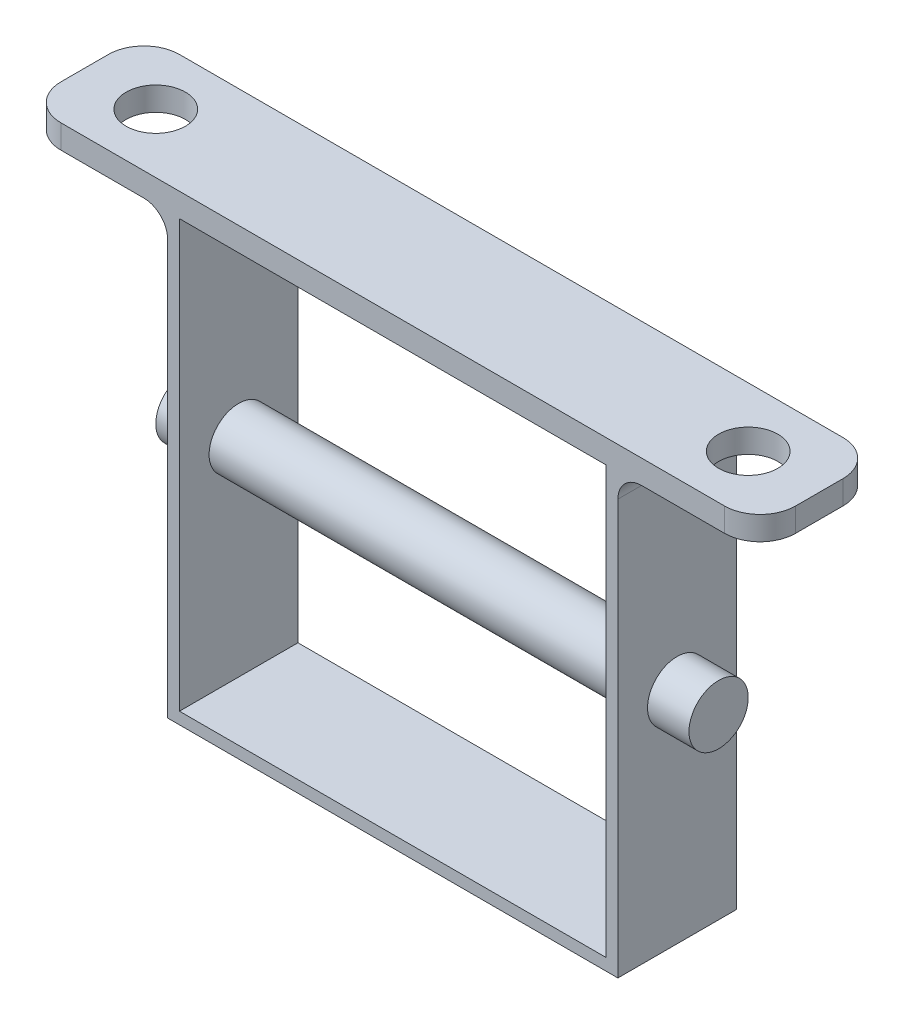
ISO-10303-21;
HEADER;
FILE_DESCRIPTION(('STEP AP214'),'2;1');
FILE_NAME('part.step','',(''),(''),'','','');
FILE_SCHEMA(('AUTOMOTIVE_DESIGN { 1 0 10303 214 1 1 1 1 }'));
ENDSEC;
DATA;
#1=APPLICATION_CONTEXT('core data for automotive mechanical design processes');
#2=APPLICATION_PROTOCOL_DEFINITION('international standard','automotive_design',2000,#1);
#3=PRODUCT_CONTEXT('',#1,'mechanical');
#4=PRODUCT('Part','Part','',(#3));
#5=PRODUCT_RELATED_PRODUCT_CATEGORY('part','',(#4));
#6=PRODUCT_DEFINITION_FORMATION('','',#4);
#7=PRODUCT_DEFINITION_CONTEXT('part definition',#1,'design');
#8=PRODUCT_DEFINITION('design','',#6,#7);
#9=PRODUCT_DEFINITION_SHAPE('','',#8);
#10=(LENGTH_UNIT() NAMED_UNIT(*) SI_UNIT(.MILLI.,.METRE.));
#11=(NAMED_UNIT(*) PLANE_ANGLE_UNIT() SI_UNIT($,.RADIAN.));
#12=(NAMED_UNIT(*) SI_UNIT($,.STERADIAN.) SOLID_ANGLE_UNIT());
#13=UNCERTAINTY_MEASURE_WITH_UNIT(LENGTH_MEASURE(1.E-05),#10,'distance_accuracy_value','');
#14=(GEOMETRIC_REPRESENTATION_CONTEXT(3) GLOBAL_UNCERTAINTY_ASSIGNED_CONTEXT((#13)) GLOBAL_UNIT_ASSIGNED_CONTEXT((#10,
#11,#12)) REPRESENTATION_CONTEXT('',''));
#15=CARTESIAN_POINT('',(0.,0.,0.));
#16=DIRECTION('',(0.,0.,1.));
#17=DIRECTION('',(1.,0.,0.));
#18=AXIS2_PLACEMENT_3D('',#15,#16,#17);
#19=CARTESIAN_POINT('',(0.,0.,25.4));
#20=DIRECTION('',(1.,0.,0.));
#21=DIRECTION('',(0.,1.,0.));
#22=AXIS2_PLACEMENT_3D('',#19,#20,#21);
#23=PLANE('',#22);
#24=CARTESIAN_POINT('',(0.,-49.53,12.7));
#25=DIRECTION('',(1.,0.,0.));
#26=DIRECTION('',(0.,1.,0.));
#27=AXIS2_PLACEMENT_3D('',#24,#25,#26);
#28=CIRCLE('',#27,6.35);
#29=CARTESIAN_POINT('',(0.,-43.18,12.7));
#30=VERTEX_POINT('',#29);
#31=EDGE_CURVE('E11',#30,#30,#28,.F.);
#32=ORIENTED_EDGE('',*,*,#31,.F.);
#33=EDGE_LOOP('',(#32));
#34=FACE_BOUND('',#33,.T.);
#35=DIRECTION('',(0.,-1.,0.));
#36=VECTOR('',#35,1.);
#37=CARTESIAN_POINT('',(0.,0.,25.4));
#38=LINE('',#37,#36);
#39=CARTESIAN_POINT('',(0.,-7.62,25.4));
#40=VERTEX_POINT('',#39);
#41=CARTESIAN_POINT('',(0.,-96.52,25.4));
#42=VERTEX_POINT('',#41);
#43=EDGE_CURVE('E215',#40,#42,#38,.T.);
#44=ORIENTED_EDGE('',*,*,#43,.F.);
#45=DIRECTION('',(0.,0.,1.));
#46=VECTOR('',#45,1.);
#47=CARTESIAN_POINT('',(0.,-7.62,0.));
#48=LINE('',#47,#46);
#49=CARTESIAN_POINT('',(0.,-7.62,0.));
#50=VERTEX_POINT('',#49);
#51=EDGE_CURVE('E237',#40,#50,#48,.F.);
#52=ORIENTED_EDGE('',*,*,#51,.T.);
#53=DIRECTION('',(0.,-1.,0.));
#54=VECTOR('',#53,1.);
#55=CARTESIAN_POINT('',(0.,0.,0.));
#56=LINE('',#55,#54);
#57=CARTESIAN_POINT('',(0.,-96.52,0.));
#58=VERTEX_POINT('',#57);
#59=EDGE_CURVE('E188',#50,#58,#56,.T.);
#60=ORIENTED_EDGE('',*,*,#59,.T.);
#61=DIRECTION('',(0.,0.,-1.));
#62=VECTOR('',#61,1.);
#63=CARTESIAN_POINT('',(0.,-96.52,25.4));
#64=LINE('',#63,#62);
#65=EDGE_CURVE('E231',#42,#58,#64,.T.);
#66=ORIENTED_EDGE('',*,*,#65,.F.);
#67=EDGE_LOOP('',(#44,#52,#60,#66));
#68=FACE_BOUND('',#67,.T.);
#69=ADVANCED_FACE('F40',(#34,#68),#23,.F.);
#70=CARTESIAN_POINT('',(96.52,0.,25.4));
#71=DIRECTION('',(-1.,0.,0.));
#72=DIRECTION('',(0.,-1.,0.));
#73=AXIS2_PLACEMENT_3D('',#70,#71,#72);
#74=PLANE('',#73);
#75=CARTESIAN_POINT('',(96.52,-49.53,12.7));
#76=DIRECTION('',(-1.,0.,0.));
#77=DIRECTION('',(0.,-1.,0.));
#78=AXIS2_PLACEMENT_3D('',#75,#76,#77);
#79=CIRCLE('',#78,6.35);
#80=CARTESIAN_POINT('',(96.52,-55.88,12.7));
#81=VERTEX_POINT('',#80);
#82=EDGE_CURVE('E49',#81,#81,#79,.F.);
#83=ORIENTED_EDGE('',*,*,#82,.F.);
#84=EDGE_LOOP('',(#83));
#85=FACE_BOUND('',#84,.T.);
#86=DIRECTION('',(0.,1.,0.));
#87=VECTOR('',#86,1.);
#88=CARTESIAN_POINT('',(96.52,0.,0.));
#89=LINE('',#88,#87);
#90=CARTESIAN_POINT('',(96.52,-96.52,0.));
#91=VERTEX_POINT('',#90);
#92=CARTESIAN_POINT('',(96.52,-7.62,0.));
#93=VERTEX_POINT('',#92);
#94=EDGE_CURVE('E218',#91,#93,#89,.T.);
#95=ORIENTED_EDGE('',*,*,#94,.T.);
#96=DIRECTION('',(0.,0.,-1.));
#97=VECTOR('',#96,1.);
#98=CARTESIAN_POINT('',(96.52,-7.62,25.4));
#99=LINE('',#98,#97);
#100=CARTESIAN_POINT('',(96.52,-7.62,25.4));
#101=VERTEX_POINT('',#100);
#102=EDGE_CURVE('E242',#93,#101,#99,.F.);
#103=ORIENTED_EDGE('',*,*,#102,.T.);
#104=DIRECTION('',(0.,1.,0.));
#105=VECTOR('',#104,1.);
#106=CARTESIAN_POINT('',(96.52,0.,25.4));
#107=LINE('',#106,#105);
#108=CARTESIAN_POINT('',(96.52,-96.52,25.4));
#109=VERTEX_POINT('',#108);
#110=EDGE_CURVE('E220',#109,#101,#107,.T.);
#111=ORIENTED_EDGE('',*,*,#110,.F.);
#112=DIRECTION('',(0.,0.,-1.));
#113=VECTOR('',#112,1.);
#114=CARTESIAN_POINT('',(96.52,-96.52,25.4));
#115=LINE('',#114,#113);
#116=EDGE_CURVE('E223',#109,#91,#115,.T.);
#117=ORIENTED_EDGE('',*,*,#116,.T.);
#118=EDGE_LOOP('',(#95,#103,#111,#117));
#119=FACE_BOUND('',#118,.T.);
#120=ADVANCED_FACE('F368',(#85,#119),#74,.F.);
#121=CARTESIAN_POINT('',(0.,0.,25.4));
#122=DIRECTION('',(0.,0.,1.));
#123=DIRECTION('',(1.,0.,0.));
#124=AXIS2_PLACEMENT_3D('',#121,#122,#123);
#125=PLANE('',#124);
#126=DIRECTION('',(-1.,0.,0.));
#127=VECTOR('',#126,1.);
#128=CARTESIAN_POINT('',(2.54,-2.54,25.4));
#129=LINE('',#128,#127);
#130=CARTESIAN_POINT('',(93.98,-2.54,25.4));
#131=VERTEX_POINT('',#130);
#132=CARTESIAN_POINT('',(2.54,-2.54,25.4));
#133=VERTEX_POINT('',#132);
#134=EDGE_CURVE('E197',#131,#133,#129,.T.);
#135=ORIENTED_EDGE('',*,*,#134,.F.);
#136=DIRECTION('',(0.,1.,0.));
#137=VECTOR('',#136,1.);
#138=CARTESIAN_POINT('',(93.98,-2.54,25.4));
#139=LINE('',#138,#137);
#140=CARTESIAN_POINT('',(93.98,-93.98,25.4));
#141=VERTEX_POINT('',#140);
#142=EDGE_CURVE('E195',#141,#131,#139,.T.);
#143=ORIENTED_EDGE('',*,*,#142,.F.);
#144=DIRECTION('',(1.,0.,0.));
#145=VECTOR('',#144,1.);
#146=CARTESIAN_POINT('',(2.54000000000001,-93.98,25.4));
#147=LINE('',#146,#145);
#148=CARTESIAN_POINT('',(2.54000000000001,-93.98,25.4));
#149=VERTEX_POINT('',#148);
#150=EDGE_CURVE('E180',#149,#141,#147,.T.);
#151=ORIENTED_EDGE('',*,*,#150,.F.);
#152=DIRECTION('',(0.,-1.,0.));
#153=VECTOR('',#152,1.);
#154=CARTESIAN_POINT('',(2.54,-2.54,25.4));
#155=LINE('',#154,#153);
#156=EDGE_CURVE('E170',#133,#149,#155,.T.);
#157=ORIENTED_EDGE('',*,*,#156,.F.);
#158=EDGE_LOOP('',(#135,#143,#151,#157));
#159=FACE_BOUND('',#158,.T.);
#160=DIRECTION('',(1.,0.,0.));
#161=VECTOR('',#160,1.);
#162=CARTESIAN_POINT('',(-30.48,2.54,25.4));
#163=LINE('',#162,#161);
#164=CARTESIAN_POINT('',(-22.86,2.54,25.4));
#165=VERTEX_POINT('',#164);
#166=CARTESIAN_POINT('',(119.38,2.54,25.4));
#167=VERTEX_POINT('',#166);
#168=EDGE_CURVE('E311',#165,#167,#163,.T.);
#169=ORIENTED_EDGE('',*,*,#168,.F.);
#170=DIRECTION('',(0.,-1.,0.));
#171=VECTOR('',#170,1.);
#172=CARTESIAN_POINT('',(-22.86,-2.54,25.4));
#173=LINE('',#172,#171);
#174=CARTESIAN_POINT('',(-22.86,-2.54,25.4));
#175=VERTEX_POINT('',#174);
#176=EDGE_CURVE('E254',#165,#175,#173,.T.);
#177=ORIENTED_EDGE('',*,*,#176,.T.);
#178=DIRECTION('',(1.,0.,0.));
#179=VECTOR('',#178,1.);
#180=CARTESIAN_POINT('',(-30.48,-2.54,25.4));
#181=LINE('',#180,#179);
#182=CARTESIAN_POINT('',(-5.08,-2.54,25.4));
#183=VERTEX_POINT('',#182);
#184=EDGE_CURVE('E322',#175,#183,#181,.T.);
#185=ORIENTED_EDGE('',*,*,#184,.T.);
#186=CARTESIAN_POINT('',(-5.08,-7.62,25.4));
#187=DIRECTION('',(0.,0.,1.));
#188=DIRECTION('',(1.,0.,0.));
#189=AXIS2_PLACEMENT_3D('',#186,#187,#188);
#190=CIRCLE('',#189,5.08);
#191=EDGE_CURVE('E244',#183,#40,#190,.F.);
#192=ORIENTED_EDGE('',*,*,#191,.T.);
#193=ORIENTED_EDGE('',*,*,#43,.T.);
#194=DIRECTION('',(1.,0.,0.));
#195=VECTOR('',#194,1.);
#196=CARTESIAN_POINT('',(0.,-96.52,25.4));
#197=LINE('',#196,#195);
#198=EDGE_CURVE('E217',#42,#109,#197,.T.);
#199=ORIENTED_EDGE('',*,*,#198,.T.);
#200=ORIENTED_EDGE('',*,*,#110,.T.);
#201=CARTESIAN_POINT('',(101.6,-7.62,25.4));
#202=DIRECTION('',(0.,0.,1.));
#203=DIRECTION('',(1.,0.,0.));
#204=AXIS2_PLACEMENT_3D('',#201,#202,#203);
#205=CIRCLE('',#204,5.08);
#206=CARTESIAN_POINT('',(101.6,-2.54,25.4));
#207=VERTEX_POINT('',#206);
#208=EDGE_CURVE('E250',#101,#207,#205,.F.);
#209=ORIENTED_EDGE('',*,*,#208,.T.);
#210=CARTESIAN_POINT('',(119.38,-2.54,25.4));
#211=VERTEX_POINT('',#210);
#212=EDGE_CURVE('E321',#207,#211,#181,.T.);
#213=ORIENTED_EDGE('',*,*,#212,.T.);
#214=DIRECTION('',(0.,-1.,0.));
#215=VECTOR('',#214,1.);
#216=CARTESIAN_POINT('',(119.38,2.54,25.4));
#217=LINE('',#216,#215);
#218=EDGE_CURVE('E252',#211,#167,#217,.F.);
#219=ORIENTED_EDGE('',*,*,#218,.T.);
#220=EDGE_LOOP('',(#169,#177,#185,#192,#193,#199,#200,#209,#213,#219));
#221=FACE_BOUND('',#220,.T.);
#222=ADVANCED_FACE('F192',(#159,#221),#125,.T.);
#223=CARTESIAN_POINT('',(0.,0.,0.));
#224=DIRECTION('',(0.,0.,1.));
#225=DIRECTION('',(1.,0.,0.));
#226=AXIS2_PLACEMENT_3D('',#223,#224,#225);
#227=PLANE('',#226);
#228=DIRECTION('',(0.,1.,0.));
#229=VECTOR('',#228,1.);
#230=CARTESIAN_POINT('',(93.98,-2.54,0.));
#231=LINE('',#230,#229);
#232=CARTESIAN_POINT('',(93.98,-93.98,0.));
#233=VERTEX_POINT('',#232);
#234=CARTESIAN_POINT('',(93.98,-2.54,0.));
#235=VERTEX_POINT('',#234);
#236=EDGE_CURVE('E206',#233,#235,#231,.T.);
#237=ORIENTED_EDGE('',*,*,#236,.T.);
#238=DIRECTION('',(-1.,0.,0.));
#239=VECTOR('',#238,1.);
#240=CARTESIAN_POINT('',(2.54,-2.54,0.));
#241=LINE('',#240,#239);
#242=CARTESIAN_POINT('',(2.54,-2.54,0.));
#243=VERTEX_POINT('',#242);
#244=EDGE_CURVE('E181',#235,#243,#241,.T.);
#245=ORIENTED_EDGE('',*,*,#244,.T.);
#246=DIRECTION('',(0.,-1.,0.));
#247=VECTOR('',#246,1.);
#248=CARTESIAN_POINT('',(2.54,-2.54,0.));
#249=LINE('',#248,#247);
#250=CARTESIAN_POINT('',(2.54000000000001,-93.98,0.));
#251=VERTEX_POINT('',#250);
#252=EDGE_CURVE('E202',#243,#251,#249,.T.);
#253=ORIENTED_EDGE('',*,*,#252,.T.);
#254=DIRECTION('',(1.,0.,0.));
#255=VECTOR('',#254,1.);
#256=CARTESIAN_POINT('',(2.54000000000001,-93.98,0.));
#257=LINE('',#256,#255);
#258=EDGE_CURVE('E187',#251,#233,#257,.T.);
#259=ORIENTED_EDGE('',*,*,#258,.T.);
#260=EDGE_LOOP('',(#237,#245,#253,#259));
#261=FACE_BOUND('',#260,.T.);
#262=DIRECTION('',(-1.,0.,0.));
#263=VECTOR('',#262,1.);
#264=CARTESIAN_POINT('',(-30.48,-2.54,0.));
#265=LINE('',#264,#263);
#266=CARTESIAN_POINT('',(-5.08,-2.54,0.));
#267=VERTEX_POINT('',#266);
#268=CARTESIAN_POINT('',(-22.86,-2.54,0.));
#269=VERTEX_POINT('',#268);
#270=EDGE_CURVE('E325',#267,#269,#265,.T.);
#271=ORIENTED_EDGE('',*,*,#270,.T.);
#272=DIRECTION('',(0.,-1.,0.));
#273=VECTOR('',#272,1.);
#274=CARTESIAN_POINT('',(-22.86,0.,0.));
#275=LINE('',#274,#273);
#276=CARTESIAN_POINT('',(-22.86,2.54,0.));
#277=VERTEX_POINT('',#276);
#278=EDGE_CURVE('E277',#269,#277,#275,.F.);
#279=ORIENTED_EDGE('',*,*,#278,.T.);
#280=DIRECTION('',(-1.,0.,0.));
#281=VECTOR('',#280,1.);
#282=CARTESIAN_POINT('',(-30.48,2.54,0.));
#283=LINE('',#282,#281);
#284=CARTESIAN_POINT('',(119.38,2.54,0.));
#285=VERTEX_POINT('',#284);
#286=EDGE_CURVE('E204',#285,#277,#283,.T.);
#287=ORIENTED_EDGE('',*,*,#286,.F.);
#288=DIRECTION('',(0.,-1.,0.));
#289=VECTOR('',#288,1.);
#290=CARTESIAN_POINT('',(119.38,0.,0.));
#291=LINE('',#290,#289);
#292=CARTESIAN_POINT('',(119.38,-2.54,0.));
#293=VERTEX_POINT('',#292);
#294=EDGE_CURVE('E274',#285,#293,#291,.T.);
#295=ORIENTED_EDGE('',*,*,#294,.T.);
#296=CARTESIAN_POINT('',(101.6,-2.54,0.));
#297=VERTEX_POINT('',#296);
#298=EDGE_CURVE('E312',#293,#297,#265,.T.);
#299=ORIENTED_EDGE('',*,*,#298,.T.);
#300=CARTESIAN_POINT('',(101.6,-7.62,0.));
#301=DIRECTION('',(0.,0.,1.));
#302=DIRECTION('',(1.,0.,0.));
#303=AXIS2_PLACEMENT_3D('',#300,#301,#302);
#304=CIRCLE('',#303,5.08);
#305=EDGE_CURVE('E248',#297,#93,#304,.T.);
#306=ORIENTED_EDGE('',*,*,#305,.T.);
#307=ORIENTED_EDGE('',*,*,#94,.F.);
#308=DIRECTION('',(1.,0.,0.));
#309=VECTOR('',#308,1.);
#310=CARTESIAN_POINT('',(0.,-96.52,0.));
#311=LINE('',#310,#309);
#312=EDGE_CURVE('E225',#58,#91,#311,.T.);
#313=ORIENTED_EDGE('',*,*,#312,.F.);
#314=ORIENTED_EDGE('',*,*,#59,.F.);
#315=CARTESIAN_POINT('',(-5.08,-7.62,0.));
#316=DIRECTION('',(0.,0.,1.));
#317=DIRECTION('',(1.,0.,0.));
#318=AXIS2_PLACEMENT_3D('',#315,#316,#317);
#319=CIRCLE('',#318,5.08);
#320=EDGE_CURVE('E246',#50,#267,#319,.T.);
#321=ORIENTED_EDGE('',*,*,#320,.T.);
#322=EDGE_LOOP('',(#271,#279,#287,#295,#299,#306,#307,#313,#314,#321));
#323=FACE_BOUND('',#322,.T.);
#324=ADVANCED_FACE('F331',(#261,#323),#227,.F.);
#325=CARTESIAN_POINT('',(0.,-96.52,25.4));
#326=DIRECTION('',(0.,1.,0.));
#327=DIRECTION('',(0.,0.,1.));
#328=AXIS2_PLACEMENT_3D('',#325,#326,#327);
#329=PLANE('',#328);
#330=ORIENTED_EDGE('',*,*,#312,.T.);
#331=ORIENTED_EDGE('',*,*,#116,.F.);
#332=ORIENTED_EDGE('',*,*,#198,.F.);
#333=ORIENTED_EDGE('',*,*,#65,.T.);
#334=EDGE_LOOP('',(#330,#331,#332,#333));
#335=FACE_BOUND('',#334,.T.);
#336=ADVANCED_FACE('F373',(#335),#329,.F.);
#337=CARTESIAN_POINT('',(2.54,-2.54,25.4));
#338=DIRECTION('',(1.,0.,0.));
#339=DIRECTION('',(0.,1.,0.));
#340=AXIS2_PLACEMENT_3D('',#337,#338,#339);
#341=PLANE('',#340);
#342=CARTESIAN_POINT('',(2.54,-49.53,12.7));
#343=DIRECTION('',(1.,0.,0.));
#344=DIRECTION('',(0.,1.,0.));
#345=AXIS2_PLACEMENT_3D('',#342,#343,#344);
#346=CIRCLE('',#345,6.35);
#347=CARTESIAN_POINT('',(2.54000000000001,-55.88,12.7));
#348=VERTEX_POINT('',#347);
#349=EDGE_CURVE('E292',#348,#348,#346,.F.);
#350=ORIENTED_EDGE('',*,*,#349,.T.);
#351=EDGE_LOOP('',(#350));
#352=FACE_BOUND('',#351,.T.);
#353=ORIENTED_EDGE('',*,*,#252,.F.);
#354=DIRECTION('',(0.,0.,-1.));
#355=VECTOR('',#354,1.);
#356=CARTESIAN_POINT('',(2.54,-2.54,25.4));
#357=LINE('',#356,#355);
#358=EDGE_CURVE('E176',#133,#243,#357,.T.);
#359=ORIENTED_EDGE('',*,*,#358,.F.);
#360=ORIENTED_EDGE('',*,*,#156,.T.);
#361=DIRECTION('',(0.,0.,-1.));
#362=VECTOR('',#361,1.);
#363=CARTESIAN_POINT('',(2.54000000000001,-93.98,25.4));
#364=LINE('',#363,#362);
#365=EDGE_CURVE('E173',#149,#251,#364,.T.);
#366=ORIENTED_EDGE('',*,*,#365,.T.);
#367=EDGE_LOOP('',(#353,#359,#360,#366));
#368=FACE_BOUND('',#367,.T.);
#369=ADVANCED_FACE('F172',(#352,#368),#341,.T.);
#370=CARTESIAN_POINT('',(2.54000000000001,-93.98,25.4));
#371=DIRECTION('',(0.,1.,0.));
#372=DIRECTION('',(0.,0.,1.));
#373=AXIS2_PLACEMENT_3D('',#370,#371,#372);
#374=PLANE('',#373);
#375=ORIENTED_EDGE('',*,*,#258,.F.);
#376=ORIENTED_EDGE('',*,*,#365,.F.);
#377=ORIENTED_EDGE('',*,*,#150,.T.);
#378=DIRECTION('',(0.,0.,-1.));
#379=VECTOR('',#378,1.);
#380=CARTESIAN_POINT('',(93.98,-93.98,25.4));
#381=LINE('',#380,#379);
#382=EDGE_CURVE('E189',#141,#233,#381,.T.);
#383=ORIENTED_EDGE('',*,*,#382,.T.);
#384=EDGE_LOOP('',(#375,#376,#377,#383));
#385=FACE_BOUND('',#384,.T.);
#386=ADVANCED_FACE('F184',(#385),#374,.T.);
#387=CARTESIAN_POINT('',(93.98,-2.54,25.4));
#388=DIRECTION('',(-1.,0.,0.));
#389=DIRECTION('',(0.,-1.,0.));
#390=AXIS2_PLACEMENT_3D('',#387,#388,#389);
#391=PLANE('',#390);
#392=CARTESIAN_POINT('',(93.98,-49.53,12.7));
#393=DIRECTION('',(-1.,0.,0.));
#394=DIRECTION('',(0.,-1.,0.));
#395=AXIS2_PLACEMENT_3D('',#392,#393,#394);
#396=CIRCLE('',#395,6.35);
#397=CARTESIAN_POINT('',(93.98,-55.88,12.7));
#398=VERTEX_POINT('',#397);
#399=EDGE_CURVE('E44',#398,#398,#396,.F.);
#400=ORIENTED_EDGE('',*,*,#399,.T.);
#401=EDGE_LOOP('',(#400));
#402=FACE_BOUND('',#401,.T.);
#403=ORIENTED_EDGE('',*,*,#236,.F.);
#404=ORIENTED_EDGE('',*,*,#382,.F.);
#405=ORIENTED_EDGE('',*,*,#142,.T.);
#406=DIRECTION('',(0.,0.,-1.));
#407=VECTOR('',#406,1.);
#408=CARTESIAN_POINT('',(93.98,-2.54,25.4));
#409=LINE('',#408,#407);
#410=EDGE_CURVE('E212',#131,#235,#409,.T.);
#411=ORIENTED_EDGE('',*,*,#410,.T.);
#412=EDGE_LOOP('',(#403,#404,#405,#411));
#413=FACE_BOUND('',#412,.T.);
#414=ADVANCED_FACE('F475',(#402,#413),#391,.T.);
#415=CARTESIAN_POINT('',(2.54,-2.54,25.4));
#416=DIRECTION('',(0.,-1.,0.));
#417=DIRECTION('',(0.,0.,-1.));
#418=AXIS2_PLACEMENT_3D('',#415,#416,#417);
#419=PLANE('',#418);
#420=ORIENTED_EDGE('',*,*,#244,.F.);
#421=ORIENTED_EDGE('',*,*,#410,.F.);
#422=ORIENTED_EDGE('',*,*,#134,.T.);
#423=ORIENTED_EDGE('',*,*,#358,.T.);
#424=EDGE_LOOP('',(#420,#421,#422,#423));
#425=FACE_BOUND('',#424,.T.);
#426=ADVANCED_FACE('F480',(#425),#419,.T.);
#427=CARTESIAN_POINT('',(0.,-2.54,0.));
#428=DIRECTION('',(0.,1.,0.));
#429=DIRECTION('',(0.,0.,1.));
#430=AXIS2_PLACEMENT_3D('',#427,#428,#429);
#431=PLANE('',#430);
#432=CARTESIAN_POINT('',(-15.2399999999999,-2.54,12.7));
#433=DIRECTION('',(0.,-1.,0.));
#434=DIRECTION('',(0.,0.,1.));
#435=AXIS2_PLACEMENT_3D('',#432,#433,#434);
#436=CIRCLE('',#435,6.35);
#437=CARTESIAN_POINT('',(-15.2399999999999,-2.54,19.05));
#438=VERTEX_POINT('',#437);
#439=EDGE_CURVE('E302',#438,#438,#436,.T.);
#440=ORIENTED_EDGE('',*,*,#439,.F.);
#441=EDGE_LOOP('',(#440));
#442=FACE_BOUND('',#441,.T.);
#443=ORIENTED_EDGE('',*,*,#184,.F.);
#444=CARTESIAN_POINT('',(-22.86,-2.54,17.78));
#445=DIRECTION('',(0.,1.,0.));
#446=DIRECTION('',(0.,0.,1.));
#447=AXIS2_PLACEMENT_3D('',#444,#445,#446);
#448=CIRCLE('',#447,7.62);
#449=CARTESIAN_POINT('',(-30.48,-2.54,17.78));
#450=VERTEX_POINT('',#449);
#451=EDGE_CURVE('E259',#175,#450,#448,.F.);
#452=ORIENTED_EDGE('',*,*,#451,.T.);
#453=DIRECTION('',(0.,0.,1.));
#454=VECTOR('',#453,1.);
#455=CARTESIAN_POINT('',(-30.48,-2.54,0.));
#456=LINE('',#455,#454);
#457=CARTESIAN_POINT('',(-30.48,-2.54,7.62));
#458=VERTEX_POINT('',#457);
#459=EDGE_CURVE('E298',#458,#450,#456,.T.);
#460=ORIENTED_EDGE('',*,*,#459,.F.);
#461=CARTESIAN_POINT('',(-22.86,-2.54,7.62));
#462=DIRECTION('',(0.,1.,0.));
#463=DIRECTION('',(0.,0.,1.));
#464=AXIS2_PLACEMENT_3D('',#461,#462,#463);
#465=CIRCLE('',#464,7.62);
#466=EDGE_CURVE('E257',#458,#269,#465,.F.);
#467=ORIENTED_EDGE('',*,*,#466,.T.);
#468=ORIENTED_EDGE('',*,*,#270,.F.);
#469=DIRECTION('',(0.,0.,1.));
#470=VECTOR('',#469,1.);
#471=CARTESIAN_POINT('',(-5.08,-2.54,25.4));
#472=LINE('',#471,#470);
#473=EDGE_CURVE('E234',#267,#183,#472,.T.);
#474=ORIENTED_EDGE('',*,*,#473,.T.);
#475=EDGE_LOOP('',(#443,#452,#460,#467,#468,#474));
#476=FACE_BOUND('',#475,.T.);
#477=ADVANCED_FACE('F380',(#442,#476),#431,.F.);
#478=CARTESIAN_POINT('',(111.76,-2.54,12.7));
#479=DIRECTION('',(0.,-1.,0.));
#480=DIRECTION('',(0.,0.,-1.));
#481=AXIS2_PLACEMENT_3D('',#478,#479,#480);
#482=CIRCLE('',#481,6.35);
#483=CARTESIAN_POINT('',(111.76,-2.54,6.35));
#484=VERTEX_POINT('',#483);
#485=EDGE_CURVE('E299',#484,#484,#482,.T.);
#486=ORIENTED_EDGE('',*,*,#485,.F.);
#487=EDGE_LOOP('',(#486));
#488=FACE_BOUND('',#487,.T.);
#489=ORIENTED_EDGE('',*,*,#298,.F.);
#490=CARTESIAN_POINT('',(119.38,-2.54,7.62));
#491=DIRECTION('',(0.,1.,0.));
#492=DIRECTION('',(0.,0.,1.));
#493=AXIS2_PLACEMENT_3D('',#490,#491,#492);
#494=CIRCLE('',#493,7.62);
#495=CARTESIAN_POINT('',(127.,-2.54,7.62));
#496=VERTEX_POINT('',#495);
#497=EDGE_CURVE('E57',#293,#496,#494,.F.);
#498=ORIENTED_EDGE('',*,*,#497,.T.);
#499=DIRECTION('',(0.,0.,-1.));
#500=VECTOR('',#499,1.);
#501=CARTESIAN_POINT('',(127.,-2.54,0.));
#502=LINE('',#501,#500);
#503=CARTESIAN_POINT('',(127.,-2.54,17.78));
#504=VERTEX_POINT('',#503);
#505=EDGE_CURVE('E324',#504,#496,#502,.T.);
#506=ORIENTED_EDGE('',*,*,#505,.F.);
#507=CARTESIAN_POINT('',(119.38,-2.54,17.78));
#508=DIRECTION('',(0.,1.,0.));
#509=DIRECTION('',(0.,0.,1.));
#510=AXIS2_PLACEMENT_3D('',#507,#508,#509);
#511=CIRCLE('',#510,7.62);
#512=EDGE_CURVE('E65',#504,#211,#511,.F.);
#513=ORIENTED_EDGE('',*,*,#512,.T.);
#514=ORIENTED_EDGE('',*,*,#212,.F.);
#515=DIRECTION('',(0.,0.,-1.));
#516=VECTOR('',#515,1.);
#517=CARTESIAN_POINT('',(101.6,-2.54,0.));
#518=LINE('',#517,#516);
#519=EDGE_CURVE('E239',#207,#297,#518,.T.);
#520=ORIENTED_EDGE('',*,*,#519,.T.);
#521=EDGE_LOOP('',(#489,#498,#506,#513,#514,#520));
#522=FACE_BOUND('',#521,.T.);
#523=ADVANCED_FACE('F359',(#488,#522),#431,.F.);
#524=CARTESIAN_POINT('',(-30.48,2.54,0.));
#525=DIRECTION('',(1.,0.,0.));
#526=DIRECTION('',(0.,0.,-1.));
#527=AXIS2_PLACEMENT_3D('',#524,#525,#526);
#528=PLANE('',#527);
#529=ORIENTED_EDGE('',*,*,#459,.T.);
#530=DIRECTION('',(0.,-1.,0.));
#531=VECTOR('',#530,1.);
#532=CARTESIAN_POINT('',(-30.48,2.54,17.78));
#533=LINE('',#532,#531);
#534=CARTESIAN_POINT('',(-30.48,2.54,17.78));
#535=VERTEX_POINT('',#534);
#536=EDGE_CURVE('E264',#450,#535,#533,.F.);
#537=ORIENTED_EDGE('',*,*,#536,.T.);
#538=DIRECTION('',(0.,0.,1.));
#539=VECTOR('',#538,1.);
#540=CARTESIAN_POINT('',(-30.48,2.54,0.));
#541=LINE('',#540,#539);
#542=CARTESIAN_POINT('',(-30.48,2.54,7.62));
#543=VERTEX_POINT('',#542);
#544=EDGE_CURVE('E308',#543,#535,#541,.T.);
#545=ORIENTED_EDGE('',*,*,#544,.F.);
#546=DIRECTION('',(0.,-1.,0.));
#547=VECTOR('',#546,1.);
#548=CARTESIAN_POINT('',(-30.48,2.54,7.62));
#549=LINE('',#548,#547);
#550=EDGE_CURVE('E261',#543,#458,#549,.T.);
#551=ORIENTED_EDGE('',*,*,#550,.T.);
#552=EDGE_LOOP('',(#529,#537,#545,#551));
#553=FACE_BOUND('',#552,.T.);
#554=ADVANCED_FACE('F346',(#553),#528,.F.);
#555=CARTESIAN_POINT('',(127.,2.54,0.));
#556=DIRECTION('',(-1.,0.,0.));
#557=DIRECTION('',(0.,0.,1.));
#558=AXIS2_PLACEMENT_3D('',#555,#556,#557);
#559=PLANE('',#558);
#560=ORIENTED_EDGE('',*,*,#505,.T.);
#561=DIRECTION('',(0.,-1.,0.));
#562=VECTOR('',#561,1.);
#563=CARTESIAN_POINT('',(127.,2.54,7.62));
#564=LINE('',#563,#562);
#565=CARTESIAN_POINT('',(127.,2.54,7.62));
#566=VERTEX_POINT('',#565);
#567=EDGE_CURVE('E282',#496,#566,#564,.F.);
#568=ORIENTED_EDGE('',*,*,#567,.T.);
#569=DIRECTION('',(0.,0.,-1.));
#570=VECTOR('',#569,1.);
#571=CARTESIAN_POINT('',(127.,2.54,0.));
#572=LINE('',#571,#570);
#573=CARTESIAN_POINT('',(127.,2.54,17.78));
#574=VERTEX_POINT('',#573);
#575=EDGE_CURVE('E315',#574,#566,#572,.T.);
#576=ORIENTED_EDGE('',*,*,#575,.F.);
#577=DIRECTION('',(0.,-1.,0.));
#578=VECTOR('',#577,1.);
#579=CARTESIAN_POINT('',(127.,-2.54,17.78));
#580=LINE('',#579,#578);
#581=EDGE_CURVE('E281',#574,#504,#580,.T.);
#582=ORIENTED_EDGE('',*,*,#581,.T.);
#583=EDGE_LOOP('',(#560,#568,#576,#582));
#584=FACE_BOUND('',#583,.T.);
#585=ADVANCED_FACE('F358',(#584),#559,.F.);
#586=CARTESIAN_POINT('',(0.,2.54,0.));
#587=DIRECTION('',(0.,1.,0.));
#588=DIRECTION('',(0.,0.,1.));
#589=AXIS2_PLACEMENT_3D('',#586,#587,#588);
#590=PLANE('',#589);
#591=CARTESIAN_POINT('',(111.76,2.54,12.7));
#592=DIRECTION('',(0.,-1.,0.));
#593=DIRECTION('',(0.,0.,-1.));
#594=AXIS2_PLACEMENT_3D('',#591,#592,#593);
#595=CIRCLE('',#594,6.35);
#596=CARTESIAN_POINT('',(111.76,2.54,6.35));
#597=VERTEX_POINT('',#596);
#598=EDGE_CURVE('E295',#597,#597,#595,.T.);
#599=ORIENTED_EDGE('',*,*,#598,.T.);
#600=EDGE_LOOP('',(#599));
#601=FACE_BOUND('',#600,.T.);
#602=CARTESIAN_POINT('',(-15.2399999999999,2.54,12.7));
#603=DIRECTION('',(0.,-1.,0.));
#604=DIRECTION('',(0.,0.,1.));
#605=AXIS2_PLACEMENT_3D('',#602,#603,#604);
#606=CIRCLE('',#605,6.35);
#607=CARTESIAN_POINT('',(-15.2399999999999,2.54,19.05));
#608=VERTEX_POINT('',#607);
#609=EDGE_CURVE('E305',#608,#608,#606,.T.);
#610=ORIENTED_EDGE('',*,*,#609,.T.);
#611=EDGE_LOOP('',(#610));
#612=FACE_BOUND('',#611,.T.);
#613=ORIENTED_EDGE('',*,*,#544,.T.);
#614=CARTESIAN_POINT('',(-22.86,2.54,17.78));
#615=DIRECTION('',(0.,1.,0.));
#616=DIRECTION('',(0.,0.,1.));
#617=AXIS2_PLACEMENT_3D('',#614,#615,#616);
#618=CIRCLE('',#617,7.62);
#619=EDGE_CURVE('E272',#535,#165,#618,.T.);
#620=ORIENTED_EDGE('',*,*,#619,.T.);
#621=ORIENTED_EDGE('',*,*,#168,.T.);
#622=CARTESIAN_POINT('',(119.38,2.54,17.78));
#623=DIRECTION('',(0.,1.,0.));
#624=DIRECTION('',(0.,0.,1.));
#625=AXIS2_PLACEMENT_3D('',#622,#623,#624);
#626=CIRCLE('',#625,7.62);
#627=EDGE_CURVE('E266',#167,#574,#626,.T.);
#628=ORIENTED_EDGE('',*,*,#627,.T.);
#629=ORIENTED_EDGE('',*,*,#575,.T.);
#630=CARTESIAN_POINT('',(119.38,2.54,7.62));
#631=DIRECTION('',(0.,1.,0.));
#632=DIRECTION('',(0.,0.,1.));
#633=AXIS2_PLACEMENT_3D('',#630,#631,#632);
#634=CIRCLE('',#633,7.62);
#635=EDGE_CURVE('E268',#566,#285,#634,.T.);
#636=ORIENTED_EDGE('',*,*,#635,.T.);
#637=ORIENTED_EDGE('',*,*,#286,.T.);
#638=CARTESIAN_POINT('',(-22.86,2.54,7.62));
#639=DIRECTION('',(0.,1.,0.));
#640=DIRECTION('',(0.,0.,1.));
#641=AXIS2_PLACEMENT_3D('',#638,#639,#640);
#642=CIRCLE('',#641,7.62);
#643=EDGE_CURVE('E270',#277,#543,#642,.T.);
#644=ORIENTED_EDGE('',*,*,#643,.T.);
#645=EDGE_LOOP('',(#613,#620,#621,#628,#629,#636,#637,#644));
#646=FACE_BOUND('',#645,.T.);
#647=ADVANCED_FACE('F343',(#601,#612,#646),#590,.T.);
#648=CARTESIAN_POINT('',(-5.08,-7.62,0.));
#649=DIRECTION('',(0.,0.,-1.));
#650=DIRECTION('',(-1.,0.,0.));
#651=AXIS2_PLACEMENT_3D('',#648,#649,#650);
#652=CYLINDRICAL_SURFACE('',#651,5.08);
#653=ORIENTED_EDGE('',*,*,#320,.F.);
#654=ORIENTED_EDGE('',*,*,#51,.F.);
#655=ORIENTED_EDGE('',*,*,#191,.F.);
#656=ORIENTED_EDGE('',*,*,#473,.F.);
#657=EDGE_LOOP('',(#653,#654,#655,#656));
#658=FACE_BOUND('',#657,.T.);
#659=ADVANCED_FACE('F378',(#658),#652,.F.);
#660=CARTESIAN_POINT('',(101.6,-7.62,0.));
#661=DIRECTION('',(0.,0.,1.));
#662=DIRECTION('',(1.,0.,0.));
#663=AXIS2_PLACEMENT_3D('',#660,#661,#662);
#664=CYLINDRICAL_SURFACE('',#663,5.08);
#665=ORIENTED_EDGE('',*,*,#208,.F.);
#666=ORIENTED_EDGE('',*,*,#102,.F.);
#667=ORIENTED_EDGE('',*,*,#305,.F.);
#668=ORIENTED_EDGE('',*,*,#519,.F.);
#669=EDGE_LOOP('',(#665,#666,#667,#668));
#670=FACE_BOUND('',#669,.T.);
#671=ADVANCED_FACE('F363',(#670),#664,.F.);
#672=CARTESIAN_POINT('',(-15.2399999999999,2.54,12.7));
#673=DIRECTION('',(0.,-1.,0.));
#674=DIRECTION('',(0.,0.,-1.));
#675=AXIS2_PLACEMENT_3D('',#672,#673,#674);
#676=CYLINDRICAL_SURFACE('',#675,6.35);
#677=ORIENTED_EDGE('',*,*,#609,.F.);
#678=EDGE_LOOP('',(#677));
#679=FACE_BOUND('',#678,.T.);
#680=ORIENTED_EDGE('',*,*,#439,.T.);
#681=EDGE_LOOP('',(#680));
#682=FACE_BOUND('',#681,.T.);
#683=ADVANCED_FACE('F397',(#679,#682),#676,.F.);
#684=CARTESIAN_POINT('',(111.76,2.54,12.7));
#685=DIRECTION('',(0.,-1.,0.));
#686=DIRECTION('',(0.,0.,-1.));
#687=AXIS2_PLACEMENT_3D('',#684,#685,#686);
#688=CYLINDRICAL_SURFACE('',#687,6.35);
#689=ORIENTED_EDGE('',*,*,#598,.F.);
#690=EDGE_LOOP('',(#689));
#691=FACE_BOUND('',#690,.T.);
#692=ORIENTED_EDGE('',*,*,#485,.T.);
#693=EDGE_LOOP('',(#692));
#694=FACE_BOUND('',#693,.T.);
#695=ADVANCED_FACE('F400',(#691,#694),#688,.F.);
#696=CARTESIAN_POINT('',(-22.86,0.,17.78));
#697=DIRECTION('',(0.,1.,0.));
#698=DIRECTION('',(0.,0.,1.));
#699=AXIS2_PLACEMENT_3D('',#696,#697,#698);
#700=CYLINDRICAL_SURFACE('',#699,7.62);
#701=ORIENTED_EDGE('',*,*,#619,.F.);
#702=ORIENTED_EDGE('',*,*,#536,.F.);
#703=ORIENTED_EDGE('',*,*,#451,.F.);
#704=ORIENTED_EDGE('',*,*,#176,.F.);
#705=EDGE_LOOP('',(#701,#702,#703,#704));
#706=FACE_BOUND('',#705,.T.);
#707=ADVANCED_FACE('F350',(#706),#700,.T.);
#708=CARTESIAN_POINT('',(-22.86,2.54,7.62));
#709=DIRECTION('',(0.,-1.,0.));
#710=DIRECTION('',(0.,0.,-1.));
#711=AXIS2_PLACEMENT_3D('',#708,#709,#710);
#712=CYLINDRICAL_SURFACE('',#711,7.62);
#713=ORIENTED_EDGE('',*,*,#643,.F.);
#714=ORIENTED_EDGE('',*,*,#278,.F.);
#715=ORIENTED_EDGE('',*,*,#466,.F.);
#716=ORIENTED_EDGE('',*,*,#550,.F.);
#717=EDGE_LOOP('',(#713,#714,#715,#716));
#718=FACE_BOUND('',#717,.T.);
#719=ADVANCED_FACE('F339',(#718),#712,.T.);
#720=CARTESIAN_POINT('',(119.38,0.,7.62));
#721=DIRECTION('',(0.,-1.,0.));
#722=DIRECTION('',(0.,0.,-1.));
#723=AXIS2_PLACEMENT_3D('',#720,#721,#722);
#724=CYLINDRICAL_SURFACE('',#723,7.62);
#725=ORIENTED_EDGE('',*,*,#635,.F.);
#726=ORIENTED_EDGE('',*,*,#567,.F.);
#727=ORIENTED_EDGE('',*,*,#497,.F.);
#728=ORIENTED_EDGE('',*,*,#294,.F.);
#729=EDGE_LOOP('',(#725,#726,#727,#728));
#730=FACE_BOUND('',#729,.T.);
#731=ADVANCED_FACE('F402',(#730),#724,.T.);
#732=CARTESIAN_POINT('',(119.38,2.54,17.78));
#733=DIRECTION('',(0.,1.,0.));
#734=DIRECTION('',(0.,0.,1.));
#735=AXIS2_PLACEMENT_3D('',#732,#733,#734);
#736=CYLINDRICAL_SURFACE('',#735,7.62);
#737=ORIENTED_EDGE('',*,*,#627,.F.);
#738=ORIENTED_EDGE('',*,*,#218,.F.);
#739=ORIENTED_EDGE('',*,*,#512,.F.);
#740=ORIENTED_EDGE('',*,*,#581,.F.);
#741=EDGE_LOOP('',(#737,#738,#739,#740));
#742=FACE_BOUND('',#741,.T.);
#743=ADVANCED_FACE('F42',(#742),#736,.T.);
#744=CARTESIAN_POINT('',(105.41,-49.53,12.7));
#745=DIRECTION('',(-1.,0.,0.));
#746=DIRECTION('',(0.,-1.,0.));
#747=AXIS2_PLACEMENT_3D('',#744,#745,#746);
#748=CYLINDRICAL_SURFACE('',#747,6.35);
#749=CARTESIAN_POINT('',(2.54000000000001,-55.88,12.7));
#750=CARTESIAN_POINT('',(3.49250000000001,-55.88,12.7));
#751=CARTESIAN_POINT('',(4.44500000000001,-55.88,12.7));
#752=CARTESIAN_POINT('',(6.35000000000001,-55.88,12.7));
#753=CARTESIAN_POINT('',(7.30250000000001,-55.88,12.7));
#754=CARTESIAN_POINT('',(9.20750000000001,-55.88,12.7));
#755=CARTESIAN_POINT('',(10.16,-55.88,12.7));
#756=CARTESIAN_POINT('',(12.065,-55.88,12.7));
#757=CARTESIAN_POINT('',(13.0175,-55.88,12.7));
#758=CARTESIAN_POINT('',(14.9225,-55.88,12.7));
#759=CARTESIAN_POINT('',(15.875,-55.88,12.7));
#760=CARTESIAN_POINT('',(17.78,-55.88,12.7));
#761=CARTESIAN_POINT('',(18.7325,-55.88,12.7));
#762=CARTESIAN_POINT('',(20.6375,-55.88,12.7));
#763=CARTESIAN_POINT('',(21.59,-55.88,12.7));
#764=CARTESIAN_POINT('',(23.495,-55.88,12.7));
#765=CARTESIAN_POINT('',(24.4475,-55.88,12.7));
#766=CARTESIAN_POINT('',(26.3525,-55.88,12.7));
#767=CARTESIAN_POINT('',(27.305,-55.88,12.7));
#768=CARTESIAN_POINT('',(29.21,-55.88,12.7));
#769=CARTESIAN_POINT('',(30.1625,-55.88,12.7));
#770=CARTESIAN_POINT('',(32.0675,-55.88,12.7));
#771=CARTESIAN_POINT('',(33.02,-55.88,12.7));
#772=CARTESIAN_POINT('',(34.925,-55.88,12.7));
#773=CARTESIAN_POINT('',(35.8775,-55.88,12.7));
#774=CARTESIAN_POINT('',(37.7825,-55.88,12.7));
#775=CARTESIAN_POINT('',(38.735,-55.88,12.7));
#776=CARTESIAN_POINT('',(40.64,-55.88,12.7));
#777=CARTESIAN_POINT('',(41.5925,-55.88,12.7));
#778=CARTESIAN_POINT('',(43.4975,-55.88,12.7));
#779=CARTESIAN_POINT('',(44.45,-55.88,12.7));
#780=CARTESIAN_POINT('',(46.355,-55.88,12.7));
#781=CARTESIAN_POINT('',(47.3075,-55.88,12.7));
#782=CARTESIAN_POINT('',(49.2125,-55.88,12.7));
#783=CARTESIAN_POINT('',(50.165,-55.88,12.7));
#784=CARTESIAN_POINT('',(52.07,-55.88,12.7));
#785=CARTESIAN_POINT('',(53.0225,-55.88,12.7));
#786=CARTESIAN_POINT('',(54.9275,-55.88,12.7));
#787=CARTESIAN_POINT('',(55.88,-55.88,12.7));
#788=CARTESIAN_POINT('',(57.785,-55.88,12.7));
#789=CARTESIAN_POINT('',(58.7375,-55.88,12.7));
#790=CARTESIAN_POINT('',(60.6425,-55.88,12.7));
#791=CARTESIAN_POINT('',(61.595,-55.88,12.7));
#792=CARTESIAN_POINT('',(63.5,-55.88,12.7));
#793=CARTESIAN_POINT('',(64.4525,-55.88,12.7));
#794=CARTESIAN_POINT('',(66.3575,-55.88,12.7));
#795=CARTESIAN_POINT('',(67.31,-55.88,12.7));
#796=CARTESIAN_POINT('',(69.215,-55.88,12.7));
#797=CARTESIAN_POINT('',(70.1675,-55.88,12.7));
#798=CARTESIAN_POINT('',(72.0725,-55.88,12.7));
#799=CARTESIAN_POINT('',(73.025,-55.88,12.7));
#800=CARTESIAN_POINT('',(74.93,-55.88,12.7));
#801=CARTESIAN_POINT('',(75.8825,-55.88,12.7));
#802=CARTESIAN_POINT('',(77.7875,-55.88,12.7));
#803=CARTESIAN_POINT('',(78.74,-55.88,12.7));
#804=CARTESIAN_POINT('',(80.645,-55.88,12.7));
#805=CARTESIAN_POINT('',(81.5975,-55.88,12.7));
#806=CARTESIAN_POINT('',(83.5025,-55.88,12.7));
#807=CARTESIAN_POINT('',(84.455,-55.88,12.7));
#808=CARTESIAN_POINT('',(86.36,-55.88,12.7));
#809=CARTESIAN_POINT('',(87.3125,-55.88,12.7));
#810=CARTESIAN_POINT('',(89.2175,-55.88,12.7));
#811=CARTESIAN_POINT('',(90.17,-55.88,12.7));
#812=CARTESIAN_POINT('',(92.075,-55.88,12.7));
#813=CARTESIAN_POINT('',(93.0275,-55.88,12.7));
#814=CARTESIAN_POINT('',(93.98,-55.88,12.7));
#815=B_SPLINE_CURVE_WITH_KNOTS('',3,(#749,#750,#751,#752,#753,#754,#755,#756,#757,#758,#759,
#760,#761,#762,#763,#764,#765,#766,#767,#768,#769,#770,#771,#772,#773,#774,#775,#776,#777,#778,
#779,#780,#781,#782,#783,#784,#785,#786,#787,#788,#789,#790,#791,#792,#793,#794,#795,#796,#797,
#798,#799,#800,#801,#802,#803,#804,#805,#806,#807,#808,#809,#810,#811,#812,#813,#814),
.UNSPECIFIED.,.F.,.F.,(4,2,2,2,2,2,2,2,2,2,2,2,2,2,2,2,2,2,2,2,2,2,2,2,2,2,2,2,2,2,2,2,4),(0.,
2.8575,5.715,8.5725,11.43,14.2875,17.145,20.0025,22.86,25.7175,28.575,31.4325,34.29,37.1475,
40.005,42.8625,45.72,48.5775,51.435,54.2925,57.15,60.0075,62.865,65.7225,68.58,71.4375,74.295,
77.1525,80.01,82.8675,85.725,88.5825,91.44),.UNSPECIFIED.);
#816=EDGE_CURVE('BSEAM408',#348,#398,#815,.T.);
#817=ORIENTED_EDGE('',*,*,#349,.F.);
#818=ORIENTED_EDGE('',*,*,#399,.F.);
#819=ORIENTED_EDGE('',*,*,#816,.T.);
#820=ORIENTED_EDGE('',*,*,#816,.F.);
#821=EDGE_LOOP('',(#817,#819,#818,#820));
#822=FACE_BOUND('',#821,.T.);
#823=ADVANCED_FACE('F408',(#822),#748,.T.);
#824=CARTESIAN_POINT('',(105.41,-49.53,12.7));
#825=DIRECTION('',(1.,0.,0.));
#826=DIRECTION('',(0.,1.,0.));
#827=AXIS2_PLACEMENT_3D('',#824,#825,#826);
#828=PLANE('',#827);
#829=CARTESIAN_POINT('',(105.41,-49.53,12.7));
#830=DIRECTION('',(1.,0.,0.));
#831=DIRECTION('',(0.,1.,0.));
#832=AXIS2_PLACEMENT_3D('',#829,#830,#831);
#833=CIRCLE('',#832,6.35);
#834=CARTESIAN_POINT('',(105.41,-43.18,12.7));
#835=VERTEX_POINT('',#834);
#836=EDGE_CURVE('E436',#835,#835,#833,.T.);
#837=ORIENTED_EDGE('',*,*,#836,.T.);
#838=EDGE_LOOP('',(#837));
#839=FACE_BOUND('',#838,.T.);
#840=ADVANCED_FACE('F413',(#839),#828,.T.);
#841=ORIENTED_EDGE('',*,*,#836,.F.);
#842=EDGE_LOOP('',(#841));
#843=FACE_BOUND('',#842,.T.);
#844=ORIENTED_EDGE('',*,*,#82,.T.);
#845=EDGE_LOOP('',(#844));
#846=FACE_BOUND('',#845,.T.);
#847=ADVANCED_FACE('F417',(#843,#846),#748,.T.);
#848=CARTESIAN_POINT('',(-8.89,-49.53,12.7));
#849=DIRECTION('',(1.,0.,0.));
#850=DIRECTION('',(0.,1.,0.));
#851=AXIS2_PLACEMENT_3D('',#848,#849,#850);
#852=CIRCLE('',#851,6.35);
#853=CARTESIAN_POINT('',(-8.89,-43.18,12.7));
#854=VERTEX_POINT('',#853);
#855=EDGE_CURVE('E437',#854,#854,#852,.T.);
#856=ORIENTED_EDGE('',*,*,#855,.T.);
#857=EDGE_LOOP('',(#856));
#858=FACE_BOUND('',#857,.T.);
#859=ORIENTED_EDGE('',*,*,#31,.T.);
#860=EDGE_LOOP('',(#859));
#861=FACE_BOUND('',#860,.T.);
#862=ADVANCED_FACE('F416',(#858,#861),#748,.T.);
#863=CARTESIAN_POINT('',(-8.89,-49.53,12.7));
#864=DIRECTION('',(1.,0.,0.));
#865=DIRECTION('',(0.,1.,0.));
#866=AXIS2_PLACEMENT_3D('',#863,#864,#865);
#867=PLANE('',#866);
#868=ORIENTED_EDGE('',*,*,#855,.F.);
#869=EDGE_LOOP('',(#868));
#870=FACE_BOUND('',#869,.T.);
#871=ADVANCED_FACE('F428',(#870),#867,.F.);
#872=CLOSED_SHELL('',(#69,#120,#222,#324,#336,#369,#386,#414,#426,#477,#523,#554,#585,#647,#659,
#671,#683,#695,#707,#719,#731,#743,#823,#840,#847,#862,#871));
#873=MANIFOLD_SOLID_BREP('B2',#872);
#874=ADVANCED_BREP_SHAPE_REPRESENTATION('',(#18,#873),#14);
#875=SHAPE_DEFINITION_REPRESENTATION(#9,#874);
ENDSEC;
END-ISO-10303-21;
